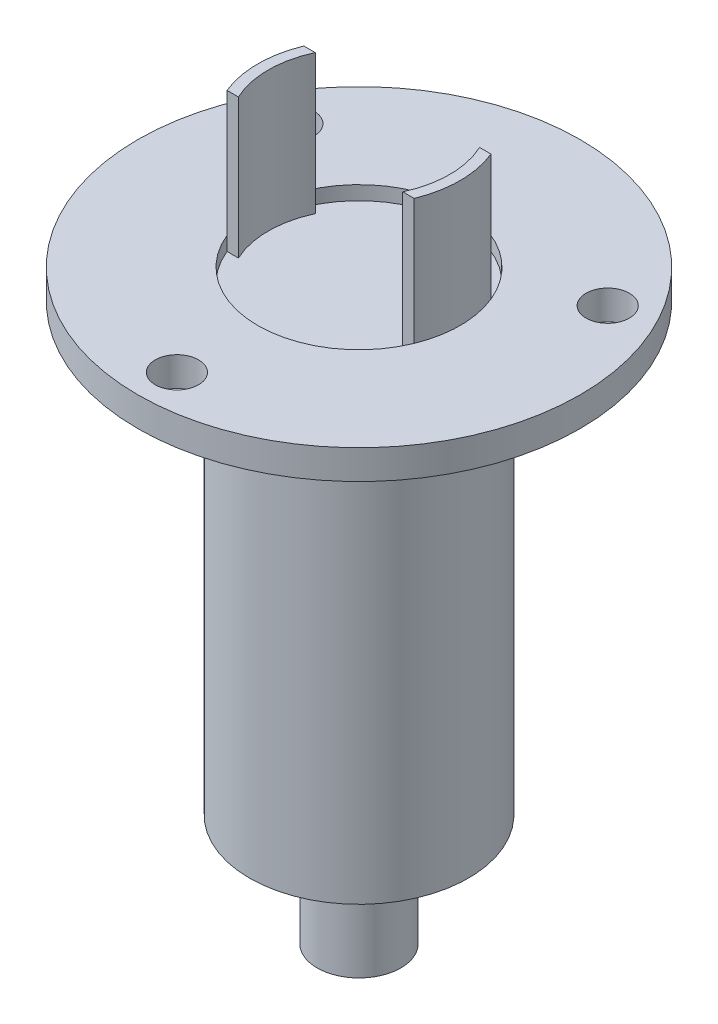
ISO-10303-21;
HEADER;
FILE_DESCRIPTION(('STEP AP214'),'2;1');
FILE_NAME('part.step','',(''),(''),'','','');
FILE_SCHEMA(('AUTOMOTIVE_DESIGN { 1 0 10303 214 1 1 1 1 }'));
ENDSEC;
DATA;
#1=APPLICATION_CONTEXT('core data for automotive mechanical design processes');
#2=APPLICATION_PROTOCOL_DEFINITION('international standard','automotive_design',2000,#1);
#3=PRODUCT_CONTEXT('',#1,'mechanical');
#4=PRODUCT('Part','Part','',(#3));
#5=PRODUCT_RELATED_PRODUCT_CATEGORY('part','',(#4));
#6=PRODUCT_DEFINITION_FORMATION('','',#4);
#7=PRODUCT_DEFINITION_CONTEXT('part definition',#1,'design');
#8=PRODUCT_DEFINITION('design','',#6,#7);
#9=PRODUCT_DEFINITION_SHAPE('','',#8);
#10=(LENGTH_UNIT() NAMED_UNIT(*) SI_UNIT(.MILLI.,.METRE.));
#11=(NAMED_UNIT(*) PLANE_ANGLE_UNIT() SI_UNIT($,.RADIAN.));
#12=(NAMED_UNIT(*) SI_UNIT($,.STERADIAN.) SOLID_ANGLE_UNIT());
#13=UNCERTAINTY_MEASURE_WITH_UNIT(LENGTH_MEASURE(1.E-05),#10,'distance_accuracy_value','');
#14=(GEOMETRIC_REPRESENTATION_CONTEXT(3) GLOBAL_UNCERTAINTY_ASSIGNED_CONTEXT((#13)) GLOBAL_UNIT_ASSIGNED_CONTEXT((#10,
#11,#12)) REPRESENTATION_CONTEXT('',''));
#15=CARTESIAN_POINT('',(0.,0.,0.));
#16=DIRECTION('',(0.,0.,1.));
#17=DIRECTION('',(1.,0.,0.));
#18=AXIS2_PLACEMENT_3D('',#15,#16,#17);
#19=CARTESIAN_POINT('',(0.,41.,0.));
#20=DIRECTION('',(0.,1.,0.));
#21=DIRECTION('',(0.,0.,1.));
#22=AXIS2_PLACEMENT_3D('',#19,#20,#21);
#23=CYLINDRICAL_SURFACE('',#22,7.25);
#24=DIRECTION('',(0.,-1.,0.));
#25=VECTOR('',#24,1.);
#26=CARTESIAN_POINT('',(6.70712251665809,51.,2.75263647191888));
#27=LINE('',#26,#25);
#28=CARTESIAN_POINT('',(6.70712251665809,42.,2.75263647191888));
#29=VERTEX_POINT('',#28);
#30=CARTESIAN_POINT('',(6.70712251665809,41.,2.75263647191888));
#31=VERTEX_POINT('',#30);
#32=EDGE_CURVE('E161',#29,#31,#27,.T.);
#33=ORIENTED_EDGE('',*,*,#32,.T.);
#34=CARTESIAN_POINT('',(0.,41.,0.));
#35=DIRECTION('',(0.,1.,0.));
#36=DIRECTION('',(0.,0.,1.));
#37=AXIS2_PLACEMENT_3D('',#34,#35,#36);
#38=CIRCLE('',#37,7.25);
#39=CARTESIAN_POINT('',(-6.70712251665809,41.,2.75263647191888));
#40=VERTEX_POINT('',#39);
#41=EDGE_CURVE('E196',#40,#31,#38,.T.);
#42=ORIENTED_EDGE('',*,*,#41,.F.);
#43=DIRECTION('',(0.,-1.,0.));
#44=VECTOR('',#43,1.);
#45=CARTESIAN_POINT('',(-6.70712251665809,51.,2.75263647191888));
#46=LINE('',#45,#44);
#47=CARTESIAN_POINT('',(-6.70712251665809,42.,2.75263647191888));
#48=VERTEX_POINT('',#47);
#49=EDGE_CURVE('E185',#48,#40,#46,.T.);
#50=ORIENTED_EDGE('',*,*,#49,.F.);
#51=CARTESIAN_POINT('',(0.,42.,0.));
#52=DIRECTION('',(0.,1.,0.));
#53=DIRECTION('',(0.,0.,1.));
#54=AXIS2_PLACEMENT_3D('',#51,#52,#53);
#55=CIRCLE('',#54,7.25);
#56=EDGE_CURVE('E203',#48,#29,#55,.T.);
#57=ORIENTED_EDGE('',*,*,#56,.T.);
#58=EDGE_LOOP('',(#33,#42,#50,#57));
#59=FACE_BOUND('',#58,.T.);
#60=ADVANCED_FACE('F38',(#59),#23,.F.);
#61=CARTESIAN_POINT('',(0.,41.,0.));
#62=DIRECTION('',(0.,1.,0.));
#63=DIRECTION('',(0.,0.,1.));
#64=AXIS2_PLACEMENT_3D('',#61,#62,#63);
#65=PLANE('',#64);
#66=ORIENTED_EDGE('',*,*,#41,.T.);
#67=DIRECTION('',(1.,0.,0.));
#68=VECTOR('',#67,1.);
#69=CARTESIAN_POINT('',(0.,41.,2.75263647191888));
#70=LINE('',#69,#68);
#71=CARTESIAN_POINT('',(5.88837774378156,41.,2.75263647191888));
#72=VERTEX_POINT('',#71);
#73=EDGE_CURVE('E146',#72,#31,#70,.T.);
#74=ORIENTED_EDGE('',*,*,#73,.F.);
#75=CARTESIAN_POINT('',(0.,41.,0.));
#76=DIRECTION('',(0.,1.,0.));
#77=DIRECTION('',(0.,0.,1.));
#78=AXIS2_PLACEMENT_3D('',#75,#76,#77);
#79=CIRCLE('',#78,6.5);
#80=CARTESIAN_POINT('',(5.88837774378156,41.,-2.75263647191888));
#81=VERTEX_POINT('',#80);
#82=EDGE_CURVE('E127',#72,#81,#79,.T.);
#83=ORIENTED_EDGE('',*,*,#82,.T.);
#84=DIRECTION('',(1.,0.,0.));
#85=VECTOR('',#84,1.);
#86=CARTESIAN_POINT('',(0.,41.,-2.75263647191888));
#87=LINE('',#86,#85);
#88=CARTESIAN_POINT('',(6.70712251665809,41.,-2.75263647191888));
#89=VERTEX_POINT('',#88);
#90=EDGE_CURVE('E144',#81,#89,#87,.T.);
#91=ORIENTED_EDGE('',*,*,#90,.T.);
#92=CARTESIAN_POINT('',(-6.70712251665809,41.,-2.75263647191888));
#93=VERTEX_POINT('',#92);
#94=EDGE_CURVE('E200',#89,#93,#38,.T.);
#95=ORIENTED_EDGE('',*,*,#94,.T.);
#96=DIRECTION('',(1.,0.,0.));
#97=VECTOR('',#96,1.);
#98=CARTESIAN_POINT('',(0.,41.,-2.75263647191888));
#99=LINE('',#98,#97);
#100=CARTESIAN_POINT('',(-5.88837774378156,41.,-2.75263647191888));
#101=VERTEX_POINT('',#100);
#102=EDGE_CURVE('E179',#93,#101,#99,.T.);
#103=ORIENTED_EDGE('',*,*,#102,.T.);
#104=CARTESIAN_POINT('',(0.,41.,0.));
#105=DIRECTION('',(0.,1.,0.));
#106=DIRECTION('',(0.,0.,1.));
#107=AXIS2_PLACEMENT_3D('',#104,#105,#106);
#108=CIRCLE('',#107,6.5);
#109=CARTESIAN_POINT('',(-5.88837774378156,41.,2.75263647191888));
#110=VERTEX_POINT('',#109);
#111=EDGE_CURVE('E164',#101,#110,#108,.T.);
#112=ORIENTED_EDGE('',*,*,#111,.T.);
#113=DIRECTION('',(1.,0.,0.));
#114=VECTOR('',#113,1.);
#115=CARTESIAN_POINT('',(0.,41.,2.75263647191888));
#116=LINE('',#115,#114);
#117=EDGE_CURVE('E169',#40,#110,#116,.T.);
#118=ORIENTED_EDGE('',*,*,#117,.F.);
#119=EDGE_LOOP('',(#66,#74,#83,#91,#95,#103,#112,#118));
#120=FACE_BOUND('',#119,.T.);
#121=ADVANCED_FACE('F236',(#120),#65,.T.);
#122=CARTESIAN_POINT('',(0.,39.9,0.));
#123=DIRECTION('',(0.,-1.,0.));
#124=DIRECTION('',(0.,0.,-1.));
#125=AXIS2_PLACEMENT_3D('',#122,#123,#124);
#126=PLANE('',#125);
#127=CARTESIAN_POINT('',(0.,39.9,13.05));
#128=DIRECTION('',(0.,-1.,0.));
#129=DIRECTION('',(0.,0.,-1.));
#130=AXIS2_PLACEMENT_3D('',#127,#128,#129);
#131=CIRCLE('',#130,1.55);
#132=CARTESIAN_POINT('',(0.,39.9,14.6));
#133=VERTEX_POINT('',#132);
#134=EDGE_CURVE('E149',#133,#133,#131,.T.);
#135=ORIENTED_EDGE('',*,*,#134,.F.);
#136=EDGE_LOOP('',(#135));
#137=FACE_BOUND('',#136,.T.);
#138=CARTESIAN_POINT('',(-11.3016315193869,39.9,-6.52500000000006));
#139=DIRECTION('',(0.,-1.,0.));
#140=DIRECTION('',(0.,0.,-1.));
#141=AXIS2_PLACEMENT_3D('',#138,#139,#140);
#142=CIRCLE('',#141,1.55);
#143=CARTESIAN_POINT('',(-11.3016315193869,39.9,-4.97500000000006));
#144=VERTEX_POINT('',#143);
#145=EDGE_CURVE('E222',#144,#144,#142,.T.);
#146=ORIENTED_EDGE('',*,*,#145,.F.);
#147=EDGE_LOOP('',(#146));
#148=FACE_BOUND('',#147,.T.);
#149=CARTESIAN_POINT('',(11.301631519387,39.9,-6.52499999999989));
#150=DIRECTION('',(0.,-1.,0.));
#151=DIRECTION('',(0.,0.,-1.));
#152=AXIS2_PLACEMENT_3D('',#149,#150,#151);
#153=CIRCLE('',#152,1.55);
#154=CARTESIAN_POINT('',(11.301631519387,39.9,-4.97499999999989));
#155=VERTEX_POINT('',#154);
#156=EDGE_CURVE('E219',#155,#155,#153,.T.);
#157=ORIENTED_EDGE('',*,*,#156,.F.);
#158=EDGE_LOOP('',(#157));
#159=FACE_BOUND('',#158,.T.);
#160=CARTESIAN_POINT('',(0.,39.9,0.));
#161=DIRECTION('',(0.,-1.,0.));
#162=DIRECTION('',(0.,0.,-1.));
#163=AXIS2_PLACEMENT_3D('',#160,#161,#162);
#164=CIRCLE('',#163,15.85);
#165=CARTESIAN_POINT('',(0.,39.9,-15.85));
#166=VERTEX_POINT('',#165);
#167=EDGE_CURVE('E11',#166,#166,#164,.T.);
#168=ORIENTED_EDGE('',*,*,#167,.T.);
#169=EDGE_LOOP('',(#168));
#170=FACE_BOUND('',#169,.T.);
#171=CARTESIAN_POINT('',(0.,39.9,0.));
#172=DIRECTION('',(0.,-1.,0.));
#173=DIRECTION('',(0.,0.,-1.));
#174=AXIS2_PLACEMENT_3D('',#171,#172,#173);
#175=CIRCLE('',#174,7.85);
#176=CARTESIAN_POINT('',(0.,39.9,-7.85));
#177=VERTEX_POINT('',#176);
#178=EDGE_CURVE('E199',#177,#177,#175,.T.);
#179=ORIENTED_EDGE('',*,*,#178,.F.);
#180=EDGE_LOOP('',(#179));
#181=FACE_BOUND('',#180,.T.);
#182=ADVANCED_FACE('F40',(#137,#148,#159,#170,#181),#126,.T.);
#183=CARTESIAN_POINT('',(0.,0.,0.));
#184=DIRECTION('',(0.,-1.,0.));
#185=DIRECTION('',(0.,0.,-1.));
#186=AXIS2_PLACEMENT_3D('',#183,#184,#185);
#187=CYLINDRICAL_SURFACE('',#186,15.85);
#188=CARTESIAN_POINT('',(0.,42.,0.));
#189=DIRECTION('',(0.,-1.,0.));
#190=DIRECTION('',(0.,0.,-1.));
#191=AXIS2_PLACEMENT_3D('',#188,#189,#190);
#192=CIRCLE('',#191,15.85);
#193=CARTESIAN_POINT('',(0.,42.,-15.85));
#194=VERTEX_POINT('',#193);
#195=EDGE_CURVE('E47',#194,#194,#192,.T.);
#196=ORIENTED_EDGE('',*,*,#195,.T.);
#197=EDGE_LOOP('',(#196));
#198=FACE_BOUND('',#197,.T.);
#199=ORIENTED_EDGE('',*,*,#167,.F.);
#200=EDGE_LOOP('',(#199));
#201=FACE_BOUND('',#200,.T.);
#202=ADVANCED_FACE('F235',(#198,#201),#187,.T.);
#203=CARTESIAN_POINT('',(0.,42.,0.));
#204=DIRECTION('',(0.,-1.,0.));
#205=DIRECTION('',(0.,0.,-1.));
#206=AXIS2_PLACEMENT_3D('',#203,#204,#205);
#207=PLANE('',#206);
#208=CARTESIAN_POINT('',(0.,42.,13.05));
#209=DIRECTION('',(0.,-1.,0.));
#210=DIRECTION('',(0.,0.,-1.));
#211=AXIS2_PLACEMENT_3D('',#208,#209,#210);
#212=CIRCLE('',#211,1.55);
#213=CARTESIAN_POINT('',(0.,42.,14.6));
#214=VERTEX_POINT('',#213);
#215=EDGE_CURVE('E42',#214,#214,#212,.T.);
#216=ORIENTED_EDGE('',*,*,#215,.T.);
#217=EDGE_LOOP('',(#216));
#218=FACE_BOUND('',#217,.T.);
#219=CARTESIAN_POINT('',(-11.3016315193869,42.,-6.52500000000006));
#220=DIRECTION('',(0.,-1.,0.));
#221=DIRECTION('',(0.,0.,-1.));
#222=AXIS2_PLACEMENT_3D('',#219,#220,#221);
#223=CIRCLE('',#222,1.55);
#224=CARTESIAN_POINT('',(-11.3016315193869,42.,-4.97500000000006));
#225=VERTEX_POINT('',#224);
#226=EDGE_CURVE('E220',#225,#225,#223,.T.);
#227=ORIENTED_EDGE('',*,*,#226,.T.);
#228=EDGE_LOOP('',(#227));
#229=FACE_BOUND('',#228,.T.);
#230=CARTESIAN_POINT('',(11.301631519387,42.,-6.52499999999989));
#231=DIRECTION('',(0.,-1.,0.));
#232=DIRECTION('',(0.,0.,-1.));
#233=AXIS2_PLACEMENT_3D('',#230,#231,#232);
#234=CIRCLE('',#233,1.55);
#235=CARTESIAN_POINT('',(11.301631519387,42.,-4.97499999999989));
#236=VERTEX_POINT('',#235);
#237=EDGE_CURVE('E217',#236,#236,#234,.T.);
#238=ORIENTED_EDGE('',*,*,#237,.T.);
#239=EDGE_LOOP('',(#238));
#240=FACE_BOUND('',#239,.T.);
#241=CARTESIAN_POINT('',(-6.70712251665809,42.,-2.75263647191888));
#242=VERTEX_POINT('',#241);
#243=EDGE_CURVE('E201',#242,#48,#55,.T.);
#244=ORIENTED_EDGE('',*,*,#243,.F.);
#245=CARTESIAN_POINT('',(6.70712251665809,42.,-2.75263647191888));
#246=VERTEX_POINT('',#245);
#247=EDGE_CURVE('E195',#246,#242,#55,.T.);
#248=ORIENTED_EDGE('',*,*,#247,.F.);
#249=CARTESIAN_POINT('',(0.,42.,0.));
#250=DIRECTION('',(0.,-1.,0.));
#251=DIRECTION('',(0.,0.,-1.));
#252=AXIS2_PLACEMENT_3D('',#249,#250,#251);
#253=CIRCLE('',#252,7.25);
#254=EDGE_CURVE('E62',#29,#246,#253,.F.);
#255=ORIENTED_EDGE('',*,*,#254,.F.);
#256=ORIENTED_EDGE('',*,*,#56,.F.);
#257=EDGE_LOOP('',(#244,#248,#255,#256));
#258=FACE_BOUND('',#257,.T.);
#259=ORIENTED_EDGE('',*,*,#195,.F.);
#260=EDGE_LOOP('',(#259));
#261=FACE_BOUND('',#260,.T.);
#262=ADVANCED_FACE('F263',(#218,#229,#240,#258,#261),#207,.F.);
#263=CARTESIAN_POINT('',(0.,0.,0.));
#264=DIRECTION('',(0.,-1.,0.));
#265=DIRECTION('',(0.,0.,-1.));
#266=AXIS2_PLACEMENT_3D('',#263,#264,#265);
#267=PLANE('',#266);
#268=CARTESIAN_POINT('',(0.,0.,0.));
#269=DIRECTION('',(0.,-1.,0.));
#270=DIRECTION('',(0.,0.,-1.));
#271=AXIS2_PLACEMENT_3D('',#268,#269,#270);
#272=CIRCLE('',#271,3.);
#273=CARTESIAN_POINT('',(0.,0.,-3.));
#274=VERTEX_POINT('',#273);
#275=EDGE_CURVE('E212',#274,#274,#272,.T.);
#276=ORIENTED_EDGE('',*,*,#275,.T.);
#277=EDGE_LOOP('',(#276));
#278=FACE_BOUND('',#277,.T.);
#279=ADVANCED_FACE('F258',(#278),#267,.T.);
#280=CARTESIAN_POINT('',(0.,0.,0.));
#281=DIRECTION('',(0.,-1.,0.));
#282=DIRECTION('',(0.,0.,-1.));
#283=AXIS2_PLACEMENT_3D('',#280,#281,#282);
#284=CYLINDRICAL_SURFACE('',#283,3.);
#285=CARTESIAN_POINT('',(0.,8.,0.));
#286=DIRECTION('',(0.,-1.,0.));
#287=DIRECTION('',(0.,0.,-1.));
#288=AXIS2_PLACEMENT_3D('',#285,#286,#287);
#289=CIRCLE('',#288,3.);
#290=CARTESIAN_POINT('',(0.,8.,-3.));
#291=VERTEX_POINT('',#290);
#292=EDGE_CURVE('E209',#291,#291,#289,.T.);
#293=ORIENTED_EDGE('',*,*,#292,.T.);
#294=EDGE_LOOP('',(#293));
#295=FACE_BOUND('',#294,.T.);
#296=ORIENTED_EDGE('',*,*,#275,.F.);
#297=EDGE_LOOP('',(#296));
#298=FACE_BOUND('',#297,.T.);
#299=ADVANCED_FACE('F252',(#295,#298),#284,.T.);
#300=CARTESIAN_POINT('',(0.,8.,0.));
#301=DIRECTION('',(0.,-1.,0.));
#302=DIRECTION('',(0.,0.,-1.));
#303=AXIS2_PLACEMENT_3D('',#300,#301,#302);
#304=PLANE('',#303);
#305=CARTESIAN_POINT('',(0.,8.,0.));
#306=DIRECTION('',(0.,-1.,0.));
#307=DIRECTION('',(0.,0.,-1.));
#308=AXIS2_PLACEMENT_3D('',#305,#306,#307);
#309=CIRCLE('',#308,7.85);
#310=CARTESIAN_POINT('',(0.,8.,-7.85));
#311=VERTEX_POINT('',#310);
#312=EDGE_CURVE('E206',#311,#311,#309,.T.);
#313=ORIENTED_EDGE('',*,*,#312,.T.);
#314=EDGE_LOOP('',(#313));
#315=FACE_BOUND('',#314,.T.);
#316=ORIENTED_EDGE('',*,*,#292,.F.);
#317=EDGE_LOOP('',(#316));
#318=FACE_BOUND('',#317,.T.);
#319=ADVANCED_FACE('F246',(#315,#318),#304,.T.);
#320=CARTESIAN_POINT('',(0.,0.,0.));
#321=DIRECTION('',(0.,-1.,0.));
#322=DIRECTION('',(0.,0.,-1.));
#323=AXIS2_PLACEMENT_3D('',#320,#321,#322);
#324=CYLINDRICAL_SURFACE('',#323,7.85);
#325=ORIENTED_EDGE('',*,*,#178,.T.);
#326=EDGE_LOOP('',(#325));
#327=FACE_BOUND('',#326,.T.);
#328=ORIENTED_EDGE('',*,*,#312,.F.);
#329=EDGE_LOOP('',(#328));
#330=FACE_BOUND('',#329,.T.);
#331=ADVANCED_FACE('F242',(#327,#330),#324,.T.);
#332=ORIENTED_EDGE('',*,*,#94,.F.);
#333=DIRECTION('',(0.,-1.,0.));
#334=VECTOR('',#333,1.);
#335=CARTESIAN_POINT('',(6.70712251665809,51.,-2.75263647191888));
#336=LINE('',#335,#334);
#337=EDGE_CURVE('E55',#246,#89,#336,.T.);
#338=ORIENTED_EDGE('',*,*,#337,.F.);
#339=ORIENTED_EDGE('',*,*,#247,.T.);
#340=DIRECTION('',(0.,-1.,0.));
#341=VECTOR('',#340,1.);
#342=CARTESIAN_POINT('',(-6.70712251665809,51.,-2.75263647191888));
#343=LINE('',#342,#341);
#344=EDGE_CURVE('E189',#242,#93,#343,.T.);
#345=ORIENTED_EDGE('',*,*,#344,.T.);
#346=EDGE_LOOP('',(#332,#338,#339,#345));
#347=FACE_BOUND('',#346,.T.);
#348=ADVANCED_FACE('F245',(#347),#23,.F.);
#349=CARTESIAN_POINT('',(0.,51.,0.));
#350=DIRECTION('',(0.,-1.,0.));
#351=DIRECTION('',(0.,0.,-1.));
#352=AXIS2_PLACEMENT_3D('',#349,#350,#351);
#353=CYLINDRICAL_SURFACE('',#352,7.25);
#354=CARTESIAN_POINT('',(-6.70712251665809,51.,-2.75263647191888));
#355=VERTEX_POINT('',#354);
#356=EDGE_CURVE('E190',#355,#242,#343,.T.);
#357=ORIENTED_EDGE('',*,*,#356,.T.);
#358=ORIENTED_EDGE('',*,*,#243,.T.);
#359=CARTESIAN_POINT('',(-6.70712251665809,51.,2.75263647191888));
#360=VERTEX_POINT('',#359);
#361=EDGE_CURVE('E186',#360,#48,#46,.T.);
#362=ORIENTED_EDGE('',*,*,#361,.F.);
#363=CARTESIAN_POINT('',(0.,51.,0.));
#364=DIRECTION('',(0.,1.,0.));
#365=DIRECTION('',(0.,0.,1.));
#366=AXIS2_PLACEMENT_3D('',#363,#364,#365);
#367=CIRCLE('',#366,7.25);
#368=EDGE_CURVE('E172',#355,#360,#367,.T.);
#369=ORIENTED_EDGE('',*,*,#368,.F.);
#370=EDGE_LOOP('',(#357,#358,#362,#369));
#371=FACE_BOUND('',#370,.T.);
#372=ADVANCED_FACE('F279',(#371),#353,.T.);
#373=CARTESIAN_POINT('',(0.,51.,0.));
#374=DIRECTION('',(0.,-1.,0.));
#375=DIRECTION('',(0.,0.,-1.));
#376=AXIS2_PLACEMENT_3D('',#373,#374,#375);
#377=CYLINDRICAL_SURFACE('',#376,6.5);
#378=ORIENTED_EDGE('',*,*,#111,.F.);
#379=DIRECTION('',(0.,-1.,0.));
#380=VECTOR('',#379,1.);
#381=CARTESIAN_POINT('',(-5.88837774378156,51.,-2.75263647191888));
#382=LINE('',#381,#380);
#383=CARTESIAN_POINT('',(-5.88837774378156,51.,-2.75263647191888));
#384=VERTEX_POINT('',#383);
#385=EDGE_CURVE('E193',#384,#101,#382,.T.);
#386=ORIENTED_EDGE('',*,*,#385,.F.);
#387=CARTESIAN_POINT('',(0.,51.,0.));
#388=DIRECTION('',(0.,1.,0.));
#389=DIRECTION('',(0.,0.,1.));
#390=AXIS2_PLACEMENT_3D('',#387,#388,#389);
#391=CIRCLE('',#390,6.5);
#392=CARTESIAN_POINT('',(-5.88837774378156,51.,2.75263647191888));
#393=VERTEX_POINT('',#392);
#394=EDGE_CURVE('E165',#384,#393,#391,.T.);
#395=ORIENTED_EDGE('',*,*,#394,.T.);
#396=DIRECTION('',(0.,-1.,0.));
#397=VECTOR('',#396,1.);
#398=CARTESIAN_POINT('',(-5.88837774378156,51.,2.75263647191888));
#399=LINE('',#398,#397);
#400=EDGE_CURVE('E176',#393,#110,#399,.T.);
#401=ORIENTED_EDGE('',*,*,#400,.T.);
#402=EDGE_LOOP('',(#378,#386,#395,#401));
#403=FACE_BOUND('',#402,.T.);
#404=ADVANCED_FACE('F283',(#403),#377,.F.);
#405=CARTESIAN_POINT('',(0.,51.,-2.75263647191888));
#406=DIRECTION('',(0.,0.,-1.));
#407=DIRECTION('',(-1.,0.,0.));
#408=AXIS2_PLACEMENT_3D('',#405,#406,#407);
#409=PLANE('',#408);
#410=ORIENTED_EDGE('',*,*,#102,.F.);
#411=ORIENTED_EDGE('',*,*,#344,.F.);
#412=ORIENTED_EDGE('',*,*,#356,.F.);
#413=DIRECTION('',(1.,0.,0.));
#414=VECTOR('',#413,1.);
#415=CARTESIAN_POINT('',(0.,51.,-2.75263647191888));
#416=LINE('',#415,#414);
#417=EDGE_CURVE('E168',#355,#384,#416,.T.);
#418=ORIENTED_EDGE('',*,*,#417,.T.);
#419=ORIENTED_EDGE('',*,*,#385,.T.);
#420=EDGE_LOOP('',(#410,#411,#412,#418,#419));
#421=FACE_BOUND('',#420,.T.);
#422=ADVANCED_FACE('F312',(#421),#409,.T.);
#423=CARTESIAN_POINT('',(0.,51.,2.75263647191888));
#424=DIRECTION('',(0.,0.,-1.));
#425=DIRECTION('',(-1.,0.,0.));
#426=AXIS2_PLACEMENT_3D('',#423,#424,#425);
#427=PLANE('',#426);
#428=ORIENTED_EDGE('',*,*,#117,.T.);
#429=ORIENTED_EDGE('',*,*,#400,.F.);
#430=DIRECTION('',(1.,0.,0.));
#431=VECTOR('',#430,1.);
#432=CARTESIAN_POINT('',(0.,51.,2.75263647191888));
#433=LINE('',#432,#431);
#434=EDGE_CURVE('E174',#360,#393,#433,.T.);
#435=ORIENTED_EDGE('',*,*,#434,.F.);
#436=ORIENTED_EDGE('',*,*,#361,.T.);
#437=ORIENTED_EDGE('',*,*,#49,.T.);
#438=EDGE_LOOP('',(#428,#429,#435,#436,#437));
#439=FACE_BOUND('',#438,.T.);
#440=ADVANCED_FACE('F303',(#439),#427,.F.);
#441=CARTESIAN_POINT('',(0.,51.,0.));
#442=DIRECTION('',(0.,1.,0.));
#443=DIRECTION('',(0.,0.,1.));
#444=AXIS2_PLACEMENT_3D('',#441,#442,#443);
#445=PLANE('',#444);
#446=ORIENTED_EDGE('',*,*,#394,.F.);
#447=ORIENTED_EDGE('',*,*,#417,.F.);
#448=ORIENTED_EDGE('',*,*,#368,.T.);
#449=ORIENTED_EDGE('',*,*,#434,.T.);
#450=EDGE_LOOP('',(#446,#447,#448,#449));
#451=FACE_BOUND('',#450,.T.);
#452=ADVANCED_FACE('F296',(#451),#445,.T.);
#453=CARTESIAN_POINT('',(0.,51.,0.));
#454=DIRECTION('',(0.,-1.,0.));
#455=DIRECTION('',(0.,0.,-1.));
#456=AXIS2_PLACEMENT_3D('',#453,#454,#455);
#457=CYLINDRICAL_SURFACE('',#456,7.25);
#458=CARTESIAN_POINT('',(6.70712251665809,51.,2.75263647191888));
#459=VERTEX_POINT('',#458);
#460=EDGE_CURVE('E130',#459,#29,#27,.T.);
#461=ORIENTED_EDGE('',*,*,#460,.T.);
#462=ORIENTED_EDGE('',*,*,#254,.T.);
#463=CARTESIAN_POINT('',(6.70712251665809,51.,-2.75263647191888));
#464=VERTEX_POINT('',#463);
#465=EDGE_CURVE('E158',#464,#246,#336,.T.);
#466=ORIENTED_EDGE('',*,*,#465,.F.);
#467=CARTESIAN_POINT('',(0.,51.,0.));
#468=DIRECTION('',(0.,1.,0.));
#469=DIRECTION('',(0.,0.,1.));
#470=AXIS2_PLACEMENT_3D('',#467,#468,#469);
#471=CIRCLE('',#470,7.25);
#472=EDGE_CURVE('E139',#459,#464,#471,.T.);
#473=ORIENTED_EDGE('',*,*,#472,.F.);
#474=EDGE_LOOP('',(#461,#462,#466,#473));
#475=FACE_BOUND('',#474,.T.);
#476=ADVANCED_FACE('F294',(#475),#457,.T.);
#477=CARTESIAN_POINT('',(0.,51.,0.));
#478=DIRECTION('',(0.,-1.,0.));
#479=DIRECTION('',(0.,0.,-1.));
#480=AXIS2_PLACEMENT_3D('',#477,#478,#479);
#481=CYLINDRICAL_SURFACE('',#480,6.5);
#482=ORIENTED_EDGE('',*,*,#82,.F.);
#483=DIRECTION('',(0.,-1.,0.));
#484=VECTOR('',#483,1.);
#485=CARTESIAN_POINT('',(5.88837774378156,51.,2.75263647191888));
#486=LINE('',#485,#484);
#487=CARTESIAN_POINT('',(5.88837774378156,51.,2.75263647191888));
#488=VERTEX_POINT('',#487);
#489=EDGE_CURVE('E120',#488,#72,#486,.T.);
#490=ORIENTED_EDGE('',*,*,#489,.F.);
#491=CARTESIAN_POINT('',(0.,51.,0.));
#492=DIRECTION('',(0.,1.,0.));
#493=DIRECTION('',(0.,0.,1.));
#494=AXIS2_PLACEMENT_3D('',#491,#492,#493);
#495=CIRCLE('',#494,6.5);
#496=CARTESIAN_POINT('',(5.88837774378156,51.,-2.75263647191888));
#497=VERTEX_POINT('',#496);
#498=EDGE_CURVE('E125',#488,#497,#495,.T.);
#499=ORIENTED_EDGE('',*,*,#498,.T.);
#500=DIRECTION('',(0.,-1.,0.));
#501=VECTOR('',#500,1.);
#502=CARTESIAN_POINT('',(5.88837774378156,51.,-2.75263647191888));
#503=LINE('',#502,#501);
#504=EDGE_CURVE('E154',#497,#81,#503,.T.);
#505=ORIENTED_EDGE('',*,*,#504,.T.);
#506=EDGE_LOOP('',(#482,#490,#499,#505));
#507=FACE_BOUND('',#506,.T.);
#508=ADVANCED_FACE('F122',(#507),#481,.F.);
#509=CARTESIAN_POINT('',(0.,51.,2.75263647191888));
#510=DIRECTION('',(0.,0.,-1.));
#511=DIRECTION('',(-1.,0.,0.));
#512=AXIS2_PLACEMENT_3D('',#509,#510,#511);
#513=PLANE('',#512);
#514=ORIENTED_EDGE('',*,*,#73,.T.);
#515=ORIENTED_EDGE('',*,*,#32,.F.);
#516=ORIENTED_EDGE('',*,*,#460,.F.);
#517=DIRECTION('',(1.,0.,0.));
#518=VECTOR('',#517,1.);
#519=CARTESIAN_POINT('',(0.,51.,2.75263647191888));
#520=LINE('',#519,#518);
#521=EDGE_CURVE('E133',#488,#459,#520,.T.);
#522=ORIENTED_EDGE('',*,*,#521,.F.);
#523=ORIENTED_EDGE('',*,*,#489,.T.);
#524=EDGE_LOOP('',(#514,#515,#516,#522,#523));
#525=FACE_BOUND('',#524,.T.);
#526=ADVANCED_FACE('F134',(#525),#513,.F.);
#527=CARTESIAN_POINT('',(0.,51.,-2.75263647191888));
#528=DIRECTION('',(0.,0.,-1.));
#529=DIRECTION('',(-1.,0.,0.));
#530=AXIS2_PLACEMENT_3D('',#527,#528,#529);
#531=PLANE('',#530);
#532=ORIENTED_EDGE('',*,*,#90,.F.);
#533=ORIENTED_EDGE('',*,*,#504,.F.);
#534=DIRECTION('',(1.,0.,0.));
#535=VECTOR('',#534,1.);
#536=CARTESIAN_POINT('',(0.,51.,-2.75263647191888));
#537=LINE('',#536,#535);
#538=EDGE_CURVE('E143',#497,#464,#537,.T.);
#539=ORIENTED_EDGE('',*,*,#538,.T.);
#540=ORIENTED_EDGE('',*,*,#465,.T.);
#541=ORIENTED_EDGE('',*,*,#337,.T.);
#542=EDGE_LOOP('',(#532,#533,#539,#540,#541));
#543=FACE_BOUND('',#542,.T.);
#544=ADVANCED_FACE('F291',(#543),#531,.T.);
#545=CARTESIAN_POINT('',(0.,51.,0.));
#546=DIRECTION('',(0.,1.,0.));
#547=DIRECTION('',(0.,0.,1.));
#548=AXIS2_PLACEMENT_3D('',#545,#546,#547);
#549=PLANE('',#548);
#550=ORIENTED_EDGE('',*,*,#498,.F.);
#551=ORIENTED_EDGE('',*,*,#521,.T.);
#552=ORIENTED_EDGE('',*,*,#472,.T.);
#553=ORIENTED_EDGE('',*,*,#538,.F.);
#554=EDGE_LOOP('',(#550,#551,#552,#553));
#555=FACE_BOUND('',#554,.T.);
#556=ADVANCED_FACE('F141',(#555),#549,.T.);
#557=CARTESIAN_POINT('',(11.301631519387,0.,-6.52499999999989));
#558=DIRECTION('',(0.,1.,0.));
#559=DIRECTION('',(0.,0.,1.));
#560=AXIS2_PLACEMENT_3D('',#557,#558,#559);
#561=CYLINDRICAL_SURFACE('',#560,1.55);
#562=CARTESIAN_POINT('',(11.301631519387,39.9,-4.97499999999989));
#563=CARTESIAN_POINT('',(11.301631519387,39.921875,-4.97499999999989));
#564=CARTESIAN_POINT('',(11.301631519387,39.94375,-4.97499999999989));
#565=CARTESIAN_POINT('',(11.301631519387,39.9875,-4.97499999999989));
#566=CARTESIAN_POINT('',(11.301631519387,40.009375,-4.97499999999989));
#567=CARTESIAN_POINT('',(11.301631519387,40.053125,-4.97499999999989));
#568=CARTESIAN_POINT('',(11.301631519387,40.075,-4.97499999999989));
#569=CARTESIAN_POINT('',(11.301631519387,40.11875,-4.97499999999989));
#570=CARTESIAN_POINT('',(11.301631519387,40.140625,-4.97499999999989));
#571=CARTESIAN_POINT('',(11.301631519387,40.184375,-4.97499999999989));
#572=CARTESIAN_POINT('',(11.301631519387,40.20625,-4.97499999999989));
#573=CARTESIAN_POINT('',(11.301631519387,40.25,-4.97499999999989));
#574=CARTESIAN_POINT('',(11.301631519387,40.271875,-4.97499999999989));
#575=CARTESIAN_POINT('',(11.301631519387,40.315625,-4.97499999999989));
#576=CARTESIAN_POINT('',(11.301631519387,40.3375,-4.97499999999989));
#577=CARTESIAN_POINT('',(11.301631519387,40.38125,-4.97499999999989));
#578=CARTESIAN_POINT('',(11.301631519387,40.403125,-4.97499999999989));
#579=CARTESIAN_POINT('',(11.301631519387,40.446875,-4.97499999999989));
#580=CARTESIAN_POINT('',(11.301631519387,40.46875,-4.97499999999989));
#581=CARTESIAN_POINT('',(11.301631519387,40.5125,-4.97499999999989));
#582=CARTESIAN_POINT('',(11.301631519387,40.534375,-4.97499999999989));
#583=CARTESIAN_POINT('',(11.301631519387,40.578125,-4.97499999999989));
#584=CARTESIAN_POINT('',(11.301631519387,40.6,-4.97499999999989));
#585=CARTESIAN_POINT('',(11.301631519387,40.64375,-4.97499999999989));
#586=CARTESIAN_POINT('',(11.301631519387,40.665625,-4.97499999999989));
#587=CARTESIAN_POINT('',(11.301631519387,40.709375,-4.97499999999989));
#588=CARTESIAN_POINT('',(11.301631519387,40.73125,-4.97499999999989));
#589=CARTESIAN_POINT('',(11.301631519387,40.775,-4.97499999999989));
#590=CARTESIAN_POINT('',(11.301631519387,40.796875,-4.97499999999989));
#591=CARTESIAN_POINT('',(11.301631519387,40.840625,-4.97499999999989));
#592=CARTESIAN_POINT('',(11.301631519387,40.8625,-4.97499999999989));
#593=CARTESIAN_POINT('',(11.301631519387,40.90625,-4.97499999999989));
#594=CARTESIAN_POINT('',(11.301631519387,40.928125,-4.97499999999989));
#595=CARTESIAN_POINT('',(11.301631519387,40.971875,-4.97499999999989));
#596=CARTESIAN_POINT('',(11.301631519387,40.99375,-4.97499999999989));
#597=CARTESIAN_POINT('',(11.301631519387,41.0375,-4.97499999999989));
#598=CARTESIAN_POINT('',(11.301631519387,41.059375,-4.97499999999989));
#599=CARTESIAN_POINT('',(11.301631519387,41.103125,-4.97499999999989));
#600=CARTESIAN_POINT('',(11.301631519387,41.125,-4.97499999999989));
#601=CARTESIAN_POINT('',(11.301631519387,41.16875,-4.97499999999989));
#602=CARTESIAN_POINT('',(11.301631519387,41.190625,-4.97499999999989));
#603=CARTESIAN_POINT('',(11.301631519387,41.234375,-4.97499999999989));
#604=CARTESIAN_POINT('',(11.301631519387,41.25625,-4.97499999999989));
#605=CARTESIAN_POINT('',(11.301631519387,41.3,-4.97499999999989));
#606=CARTESIAN_POINT('',(11.301631519387,41.321875,-4.97499999999989));
#607=CARTESIAN_POINT('',(11.301631519387,41.365625,-4.97499999999989));
#608=CARTESIAN_POINT('',(11.301631519387,41.3875,-4.97499999999989));
#609=CARTESIAN_POINT('',(11.301631519387,41.43125,-4.97499999999989));
#610=CARTESIAN_POINT('',(11.301631519387,41.453125,-4.97499999999989));
#611=CARTESIAN_POINT('',(11.301631519387,41.496875,-4.97499999999989));
#612=CARTESIAN_POINT('',(11.301631519387,41.51875,-4.97499999999989));
#613=CARTESIAN_POINT('',(11.301631519387,41.5625,-4.97499999999989));
#614=CARTESIAN_POINT('',(11.301631519387,41.584375,-4.97499999999989));
#615=CARTESIAN_POINT('',(11.301631519387,41.628125,-4.97499999999989));
#616=CARTESIAN_POINT('',(11.301631519387,41.65,-4.97499999999989));
#617=CARTESIAN_POINT('',(11.301631519387,41.69375,-4.97499999999989));
#618=CARTESIAN_POINT('',(11.301631519387,41.715625,-4.97499999999989));
#619=CARTESIAN_POINT('',(11.301631519387,41.759375,-4.97499999999989));
#620=CARTESIAN_POINT('',(11.301631519387,41.78125,-4.97499999999989));
#621=CARTESIAN_POINT('',(11.301631519387,41.825,-4.97499999999989));
#622=CARTESIAN_POINT('',(11.301631519387,41.846875,-4.97499999999989));
#623=CARTESIAN_POINT('',(11.301631519387,41.890625,-4.97499999999989));
#624=CARTESIAN_POINT('',(11.301631519387,41.9125,-4.97499999999989));
#625=CARTESIAN_POINT('',(11.301631519387,41.95625,-4.97499999999989));
#626=CARTESIAN_POINT('',(11.301631519387,41.978125,-4.97499999999989));
#627=CARTESIAN_POINT('',(11.301631519387,42.,-4.97499999999989));
#628=B_SPLINE_CURVE_WITH_KNOTS('',3,(#562,#563,#564,#565,#566,#567,#568,#569,#570,#571,#572,
#573,#574,#575,#576,#577,#578,#579,#580,#581,#582,#583,#584,#585,#586,#587,#588,#589,#590,#591,
#592,#593,#594,#595,#596,#597,#598,#599,#600,#601,#602,#603,#604,#605,#606,#607,#608,#609,#610,
#611,#612,#613,#614,#615,#616,#617,#618,#619,#620,#621,#622,#623,#624,#625,#626,#627),
.UNSPECIFIED.,.F.,.F.,(4,2,2,2,2,2,2,2,2,2,2,2,2,2,2,2,2,2,2,2,2,2,2,2,2,2,2,2,2,2,2,2,4),(0.,
0.0656249999999997,0.131249999999999,0.196874999999999,0.262499999999999,0.328124999999999,
0.393749999999998,0.459374999999998,0.524999999999998,0.590624999999997,0.656249999999997,
0.721874999999997,0.787499999999997,0.853124999999996,0.918749999999996,0.984374999999996,1.05,
1.115625,1.18124999999999,1.24687499999999,1.31249999999999,1.37812499999999,1.44374999999999,
1.50937499999999,1.57499999999999,1.64062499999999,1.70624999999999,1.77187499999999,
1.83749999999999,1.90312499999999,1.96874999999999,2.03437499999999,2.09999999999999),.UNSPECIFIED.);
#629=EDGE_CURVE('BSEAM230',#155,#236,#628,.T.);
#630=ORIENTED_EDGE('',*,*,#156,.T.);
#631=ORIENTED_EDGE('',*,*,#237,.F.);
#632=ORIENTED_EDGE('',*,*,#629,.T.);
#633=ORIENTED_EDGE('',*,*,#629,.F.);
#634=EDGE_LOOP('',(#630,#632,#631,#633));
#635=FACE_BOUND('',#634,.T.);
#636=ADVANCED_FACE('F230',(#635),#561,.F.);
#637=CARTESIAN_POINT('',(-11.3016315193869,0.,-6.52500000000006));
#638=DIRECTION('',(0.,1.,0.));
#639=DIRECTION('',(0.,0.,1.));
#640=AXIS2_PLACEMENT_3D('',#637,#638,#639);
#641=CYLINDRICAL_SURFACE('',#640,1.55);
#642=CARTESIAN_POINT('',(-11.3016315193869,39.9,-4.97500000000006));
#643=CARTESIAN_POINT('',(-11.3016315193869,39.921875,-4.97500000000006));
#644=CARTESIAN_POINT('',(-11.3016315193869,39.94375,-4.97500000000006));
#645=CARTESIAN_POINT('',(-11.3016315193869,39.9875,-4.97500000000006));
#646=CARTESIAN_POINT('',(-11.3016315193869,40.009375,-4.97500000000006));
#647=CARTESIAN_POINT('',(-11.3016315193869,40.053125,-4.97500000000006));
#648=CARTESIAN_POINT('',(-11.3016315193869,40.075,-4.97500000000006));
#649=CARTESIAN_POINT('',(-11.3016315193869,40.11875,-4.97500000000006));
#650=CARTESIAN_POINT('',(-11.3016315193869,40.140625,-4.97500000000006));
#651=CARTESIAN_POINT('',(-11.3016315193869,40.184375,-4.97500000000006));
#652=CARTESIAN_POINT('',(-11.3016315193869,40.20625,-4.97500000000006));
#653=CARTESIAN_POINT('',(-11.3016315193869,40.25,-4.97500000000006));
#654=CARTESIAN_POINT('',(-11.3016315193869,40.271875,-4.97500000000006));
#655=CARTESIAN_POINT('',(-11.3016315193869,40.315625,-4.97500000000006));
#656=CARTESIAN_POINT('',(-11.3016315193869,40.3375,-4.97500000000006));
#657=CARTESIAN_POINT('',(-11.3016315193869,40.38125,-4.97500000000006));
#658=CARTESIAN_POINT('',(-11.3016315193869,40.403125,-4.97500000000006));
#659=CARTESIAN_POINT('',(-11.3016315193869,40.446875,-4.97500000000006));
#660=CARTESIAN_POINT('',(-11.3016315193869,40.46875,-4.97500000000006));
#661=CARTESIAN_POINT('',(-11.3016315193869,40.5125,-4.97500000000006));
#662=CARTESIAN_POINT('',(-11.3016315193869,40.534375,-4.97500000000006));
#663=CARTESIAN_POINT('',(-11.3016315193869,40.578125,-4.97500000000006));
#664=CARTESIAN_POINT('',(-11.3016315193869,40.6,-4.97500000000006));
#665=CARTESIAN_POINT('',(-11.3016315193869,40.64375,-4.97500000000006));
#666=CARTESIAN_POINT('',(-11.3016315193869,40.665625,-4.97500000000006));
#667=CARTESIAN_POINT('',(-11.3016315193869,40.709375,-4.97500000000006));
#668=CARTESIAN_POINT('',(-11.3016315193869,40.73125,-4.97500000000006));
#669=CARTESIAN_POINT('',(-11.3016315193869,40.775,-4.97500000000006));
#670=CARTESIAN_POINT('',(-11.3016315193869,40.796875,-4.97500000000006));
#671=CARTESIAN_POINT('',(-11.3016315193869,40.840625,-4.97500000000006));
#672=CARTESIAN_POINT('',(-11.3016315193869,40.8625,-4.97500000000006));
#673=CARTESIAN_POINT('',(-11.3016315193869,40.90625,-4.97500000000006));
#674=CARTESIAN_POINT('',(-11.3016315193869,40.928125,-4.97500000000006));
#675=CARTESIAN_POINT('',(-11.3016315193869,40.971875,-4.97500000000006));
#676=CARTESIAN_POINT('',(-11.3016315193869,40.99375,-4.97500000000006));
#677=CARTESIAN_POINT('',(-11.3016315193869,41.0375,-4.97500000000006));
#678=CARTESIAN_POINT('',(-11.3016315193869,41.059375,-4.97500000000006));
#679=CARTESIAN_POINT('',(-11.3016315193869,41.103125,-4.97500000000006));
#680=CARTESIAN_POINT('',(-11.3016315193869,41.125,-4.97500000000006));
#681=CARTESIAN_POINT('',(-11.3016315193869,41.16875,-4.97500000000006));
#682=CARTESIAN_POINT('',(-11.3016315193869,41.190625,-4.97500000000006));
#683=CARTESIAN_POINT('',(-11.3016315193869,41.234375,-4.97500000000006));
#684=CARTESIAN_POINT('',(-11.3016315193869,41.25625,-4.97500000000006));
#685=CARTESIAN_POINT('',(-11.3016315193869,41.3,-4.97500000000006));
#686=CARTESIAN_POINT('',(-11.3016315193869,41.321875,-4.97500000000006));
#687=CARTESIAN_POINT('',(-11.3016315193869,41.365625,-4.97500000000006));
#688=CARTESIAN_POINT('',(-11.3016315193869,41.3875,-4.97500000000006));
#689=CARTESIAN_POINT('',(-11.3016315193869,41.43125,-4.97500000000006));
#690=CARTESIAN_POINT('',(-11.3016315193869,41.453125,-4.97500000000006));
#691=CARTESIAN_POINT('',(-11.3016315193869,41.496875,-4.97500000000006));
#692=CARTESIAN_POINT('',(-11.3016315193869,41.51875,-4.97500000000006));
#693=CARTESIAN_POINT('',(-11.3016315193869,41.5625,-4.97500000000006));
#694=CARTESIAN_POINT('',(-11.3016315193869,41.584375,-4.97500000000006));
#695=CARTESIAN_POINT('',(-11.3016315193869,41.628125,-4.97500000000006));
#696=CARTESIAN_POINT('',(-11.3016315193869,41.65,-4.97500000000006));
#697=CARTESIAN_POINT('',(-11.3016315193869,41.69375,-4.97500000000006));
#698=CARTESIAN_POINT('',(-11.3016315193869,41.715625,-4.97500000000006));
#699=CARTESIAN_POINT('',(-11.3016315193869,41.759375,-4.97500000000006));
#700=CARTESIAN_POINT('',(-11.3016315193869,41.78125,-4.97500000000006));
#701=CARTESIAN_POINT('',(-11.3016315193869,41.825,-4.97500000000006));
#702=CARTESIAN_POINT('',(-11.3016315193869,41.846875,-4.97500000000006));
#703=CARTESIAN_POINT('',(-11.3016315193869,41.890625,-4.97500000000006));
#704=CARTESIAN_POINT('',(-11.3016315193869,41.9125,-4.97500000000006));
#705=CARTESIAN_POINT('',(-11.3016315193869,41.95625,-4.97500000000006));
#706=CARTESIAN_POINT('',(-11.3016315193869,41.978125,-4.97500000000006));
#707=CARTESIAN_POINT('',(-11.3016315193869,42.,-4.97500000000006));
#708=B_SPLINE_CURVE_WITH_KNOTS('',3,(#642,#643,#644,#645,#646,#647,#648,#649,#650,#651,#652,
#653,#654,#655,#656,#657,#658,#659,#660,#661,#662,#663,#664,#665,#666,#667,#668,#669,#670,#671,
#672,#673,#674,#675,#676,#677,#678,#679,#680,#681,#682,#683,#684,#685,#686,#687,#688,#689,#690,
#691,#692,#693,#694,#695,#696,#697,#698,#699,#700,#701,#702,#703,#704,#705,#706,#707),
.UNSPECIFIED.,.F.,.F.,(4,2,2,2,2,2,2,2,2,2,2,2,2,2,2,2,2,2,2,2,2,2,2,2,2,2,2,2,2,2,2,2,4),(0.,
0.0656249999999997,0.131249999999999,0.196874999999999,0.262499999999999,0.328124999999999,
0.393749999999998,0.459374999999998,0.524999999999998,0.590624999999997,0.656249999999997,
0.721874999999997,0.787499999999997,0.853124999999996,0.918749999999996,0.984374999999996,1.05,
1.115625,1.18124999999999,1.24687499999999,1.31249999999999,1.37812499999999,1.44374999999999,
1.50937499999999,1.57499999999999,1.64062499999999,1.70624999999999,1.77187499999999,
1.83749999999999,1.90312499999999,1.96874999999999,2.03437499999999,2.09999999999999),.UNSPECIFIED.);
#709=EDGE_CURVE('BSEAM359',#144,#225,#708,.T.);
#710=ORIENTED_EDGE('',*,*,#145,.T.);
#711=ORIENTED_EDGE('',*,*,#226,.F.);
#712=ORIENTED_EDGE('',*,*,#709,.T.);
#713=ORIENTED_EDGE('',*,*,#709,.F.);
#714=EDGE_LOOP('',(#710,#712,#711,#713));
#715=FACE_BOUND('',#714,.T.);
#716=ADVANCED_FACE('F359',(#715),#641,.F.);
#717=CARTESIAN_POINT('',(0.,0.,13.05));
#718=DIRECTION('',(0.,1.,0.));
#719=DIRECTION('',(0.,0.,1.));
#720=AXIS2_PLACEMENT_3D('',#717,#718,#719);
#721=CYLINDRICAL_SURFACE('',#720,1.55);
#722=CARTESIAN_POINT('',(0.,39.9,14.6));
#723=CARTESIAN_POINT('',(0.,39.921875,14.6));
#724=CARTESIAN_POINT('',(0.,39.94375,14.6));
#725=CARTESIAN_POINT('',(0.,39.9875,14.6));
#726=CARTESIAN_POINT('',(0.,40.009375,14.6));
#727=CARTESIAN_POINT('',(0.,40.053125,14.6));
#728=CARTESIAN_POINT('',(0.,40.075,14.6));
#729=CARTESIAN_POINT('',(0.,40.11875,14.6));
#730=CARTESIAN_POINT('',(0.,40.140625,14.6));
#731=CARTESIAN_POINT('',(0.,40.184375,14.6));
#732=CARTESIAN_POINT('',(0.,40.20625,14.6));
#733=CARTESIAN_POINT('',(0.,40.25,14.6));
#734=CARTESIAN_POINT('',(0.,40.271875,14.6));
#735=CARTESIAN_POINT('',(0.,40.315625,14.6));
#736=CARTESIAN_POINT('',(0.,40.3375,14.6));
#737=CARTESIAN_POINT('',(0.,40.38125,14.6));
#738=CARTESIAN_POINT('',(0.,40.403125,14.6));
#739=CARTESIAN_POINT('',(0.,40.446875,14.6));
#740=CARTESIAN_POINT('',(0.,40.46875,14.6));
#741=CARTESIAN_POINT('',(0.,40.5125,14.6));
#742=CARTESIAN_POINT('',(0.,40.534375,14.6));
#743=CARTESIAN_POINT('',(0.,40.578125,14.6));
#744=CARTESIAN_POINT('',(0.,40.6,14.6));
#745=CARTESIAN_POINT('',(0.,40.64375,14.6));
#746=CARTESIAN_POINT('',(0.,40.665625,14.6));
#747=CARTESIAN_POINT('',(0.,40.709375,14.6));
#748=CARTESIAN_POINT('',(0.,40.73125,14.6));
#749=CARTESIAN_POINT('',(0.,40.775,14.6));
#750=CARTESIAN_POINT('',(0.,40.796875,14.6));
#751=CARTESIAN_POINT('',(0.,40.840625,14.6));
#752=CARTESIAN_POINT('',(0.,40.8625,14.6));
#753=CARTESIAN_POINT('',(0.,40.90625,14.6));
#754=CARTESIAN_POINT('',(0.,40.928125,14.6));
#755=CARTESIAN_POINT('',(0.,40.971875,14.6));
#756=CARTESIAN_POINT('',(0.,40.99375,14.6));
#757=CARTESIAN_POINT('',(0.,41.0375,14.6));
#758=CARTESIAN_POINT('',(0.,41.059375,14.6));
#759=CARTESIAN_POINT('',(0.,41.103125,14.6));
#760=CARTESIAN_POINT('',(0.,41.125,14.6));
#761=CARTESIAN_POINT('',(0.,41.16875,14.6));
#762=CARTESIAN_POINT('',(0.,41.190625,14.6));
#763=CARTESIAN_POINT('',(0.,41.234375,14.6));
#764=CARTESIAN_POINT('',(0.,41.25625,14.6));
#765=CARTESIAN_POINT('',(0.,41.3,14.6));
#766=CARTESIAN_POINT('',(0.,41.321875,14.6));
#767=CARTESIAN_POINT('',(0.,41.365625,14.6));
#768=CARTESIAN_POINT('',(0.,41.3875,14.6));
#769=CARTESIAN_POINT('',(0.,41.43125,14.6));
#770=CARTESIAN_POINT('',(0.,41.453125,14.6));
#771=CARTESIAN_POINT('',(0.,41.496875,14.6));
#772=CARTESIAN_POINT('',(0.,41.51875,14.6));
#773=CARTESIAN_POINT('',(0.,41.5625,14.6));
#774=CARTESIAN_POINT('',(0.,41.584375,14.6));
#775=CARTESIAN_POINT('',(0.,41.628125,14.6));
#776=CARTESIAN_POINT('',(0.,41.65,14.6));
#777=CARTESIAN_POINT('',(0.,41.69375,14.6));
#778=CARTESIAN_POINT('',(0.,41.715625,14.6));
#779=CARTESIAN_POINT('',(0.,41.759375,14.6));
#780=CARTESIAN_POINT('',(0.,41.78125,14.6));
#781=CARTESIAN_POINT('',(0.,41.825,14.6));
#782=CARTESIAN_POINT('',(0.,41.846875,14.6));
#783=CARTESIAN_POINT('',(0.,41.890625,14.6));
#784=CARTESIAN_POINT('',(0.,41.9125,14.6));
#785=CARTESIAN_POINT('',(0.,41.95625,14.6));
#786=CARTESIAN_POINT('',(0.,41.978125,14.6));
#787=CARTESIAN_POINT('',(0.,42.,14.6));
#788=B_SPLINE_CURVE_WITH_KNOTS('',3,(#722,#723,#724,#725,#726,#727,#728,#729,#730,#731,#732,
#733,#734,#735,#736,#737,#738,#739,#740,#741,#742,#743,#744,#745,#746,#747,#748,#749,#750,#751,
#752,#753,#754,#755,#756,#757,#758,#759,#760,#761,#762,#763,#764,#765,#766,#767,#768,#769,#770,
#771,#772,#773,#774,#775,#776,#777,#778,#779,#780,#781,#782,#783,#784,#785,#786,#787),
.UNSPECIFIED.,.F.,.F.,(4,2,2,2,2,2,2,2,2,2,2,2,2,2,2,2,2,2,2,2,2,2,2,2,2,2,2,2,2,2,2,2,4),(0.,
0.0656249999999997,0.131249999999999,0.196874999999999,0.262499999999999,0.328124999999999,
0.393749999999998,0.459374999999998,0.524999999999998,0.590624999999997,0.656249999999997,
0.721874999999997,0.787499999999997,0.853124999999996,0.918749999999996,0.984374999999996,1.05,
1.115625,1.18124999999999,1.24687499999999,1.31249999999999,1.37812499999999,1.44374999999999,
1.50937499999999,1.57499999999999,1.64062499999999,1.70624999999999,1.77187499999999,
1.83749999999999,1.90312499999999,1.96874999999999,2.03437499999999,2.09999999999999),.UNSPECIFIED.);
#789=EDGE_CURVE('BSEAM370',#133,#214,#788,.T.);
#790=ORIENTED_EDGE('',*,*,#134,.T.);
#791=ORIENTED_EDGE('',*,*,#215,.F.);
#792=ORIENTED_EDGE('',*,*,#789,.T.);
#793=ORIENTED_EDGE('',*,*,#789,.F.);
#794=EDGE_LOOP('',(#790,#792,#791,#793));
#795=FACE_BOUND('',#794,.T.);
#796=ADVANCED_FACE('F370',(#795),#721,.F.);
#797=CLOSED_SHELL('',(#60,#121,#182,#202,#262,#279,#299,#319,#331,#348,#372,#404,#422,#440,#452,
#476,#508,#526,#544,#556,#636,#716,#796));
#798=MANIFOLD_SOLID_BREP('B2',#797);
#799=ADVANCED_BREP_SHAPE_REPRESENTATION('',(#18,#798),#14);
#800=SHAPE_DEFINITION_REPRESENTATION(#9,#799);
ENDSEC;
END-ISO-10303-21;
